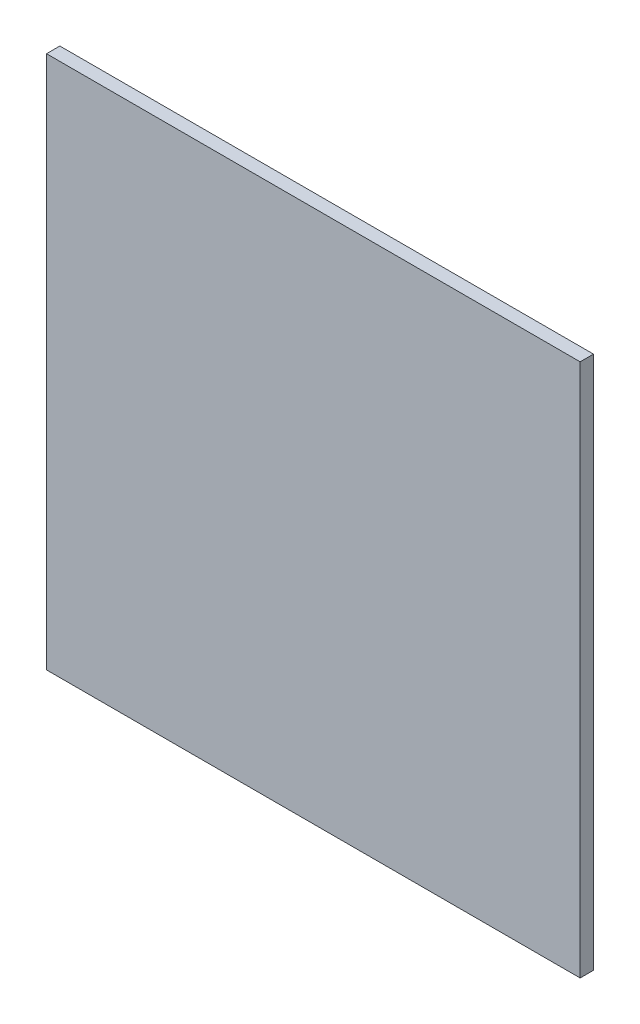
ISO-10303-21;
HEADER;
FILE_DESCRIPTION(('STEP AP214'),'2;1');
FILE_NAME('part.step','',(''),(''),'','','');
FILE_SCHEMA(('AUTOMOTIVE_DESIGN { 1 0 10303 214 1 1 1 1 }'));
ENDSEC;
DATA;
#1=APPLICATION_CONTEXT('core data for automotive mechanical design processes');
#2=APPLICATION_PROTOCOL_DEFINITION('international standard','automotive_design',2000,#1);
#3=PRODUCT_CONTEXT('',#1,'mechanical');
#4=PRODUCT('Part','Part','',(#3));
#5=PRODUCT_RELATED_PRODUCT_CATEGORY('part','',(#4));
#6=PRODUCT_DEFINITION_FORMATION('','',#4);
#7=PRODUCT_DEFINITION_CONTEXT('part definition',#1,'design');
#8=PRODUCT_DEFINITION('design','',#6,#7);
#9=PRODUCT_DEFINITION_SHAPE('','',#8);
#10=(LENGTH_UNIT() NAMED_UNIT(*) SI_UNIT(.MILLI.,.METRE.));
#11=(NAMED_UNIT(*) PLANE_ANGLE_UNIT() SI_UNIT($,.RADIAN.));
#12=(NAMED_UNIT(*) SI_UNIT($,.STERADIAN.) SOLID_ANGLE_UNIT());
#13=UNCERTAINTY_MEASURE_WITH_UNIT(LENGTH_MEASURE(1.E-05),#10,'distance_accuracy_value','');
#14=(GEOMETRIC_REPRESENTATION_CONTEXT(3) GLOBAL_UNCERTAINTY_ASSIGNED_CONTEXT((#13)) GLOBAL_UNIT_ASSIGNED_CONTEXT((#10,
#11,#12)) REPRESENTATION_CONTEXT('',''));
#15=CARTESIAN_POINT('',(0.,0.,0.));
#16=DIRECTION('',(0.,0.,1.));
#17=DIRECTION('',(1.,0.,0.));
#18=AXIS2_PLACEMENT_3D('',#15,#16,#17);
#19=CARTESIAN_POINT('',(200.,-200.,10.));
#20=DIRECTION('',(-1.,0.,0.));
#21=DIRECTION('',(0.,0.,1.));
#22=AXIS2_PLACEMENT_3D('',#19,#20,#21);
#23=PLANE('',#22);
#24=DIRECTION('',(0.,1.,0.));
#25=VECTOR('',#24,1.);
#26=CARTESIAN_POINT('',(200.,-200.,0.));
#27=LINE('',#26,#25);
#28=CARTESIAN_POINT('',(200.,-200.,0.));
#29=VERTEX_POINT('',#28);
#30=CARTESIAN_POINT('',(200.,200.,0.));
#31=VERTEX_POINT('',#30);
#32=EDGE_CURVE('E102',#29,#31,#27,.T.);
#33=ORIENTED_EDGE('',*,*,#32,.T.);
#34=DIRECTION('',(0.,0.,-1.));
#35=VECTOR('',#34,1.);
#36=CARTESIAN_POINT('',(200.,200.,10.));
#37=LINE('',#36,#35);
#38=CARTESIAN_POINT('',(200.,200.,10.));
#39=VERTEX_POINT('',#38);
#40=EDGE_CURVE('E11',#39,#31,#37,.T.);
#41=ORIENTED_EDGE('',*,*,#40,.F.);
#42=DIRECTION('',(0.,1.,0.));
#43=VECTOR('',#42,1.);
#44=CARTESIAN_POINT('',(200.,-200.,10.));
#45=LINE('',#44,#43);
#46=CARTESIAN_POINT('',(200.,-200.,10.));
#47=VERTEX_POINT('',#46);
#48=EDGE_CURVE('E90',#47,#39,#45,.T.);
#49=ORIENTED_EDGE('',*,*,#48,.F.);
#50=DIRECTION('',(0.,0.,-1.));
#51=VECTOR('',#50,1.);
#52=CARTESIAN_POINT('',(200.,-200.,10.));
#53=LINE('',#52,#51);
#54=EDGE_CURVE('E98',#47,#29,#53,.T.);
#55=ORIENTED_EDGE('',*,*,#54,.T.);
#56=EDGE_LOOP('',(#33,#41,#49,#55));
#57=FACE_BOUND('',#56,.T.);
#58=ADVANCED_FACE('F39',(#57),#23,.F.);
#59=CARTESIAN_POINT('',(-200.,200.,10.));
#60=DIRECTION('',(0.,-1.,0.));
#61=DIRECTION('',(0.,0.,-1.));
#62=AXIS2_PLACEMENT_3D('',#59,#60,#61);
#63=PLANE('',#62);
#64=DIRECTION('',(-1.,0.,0.));
#65=VECTOR('',#64,1.);
#66=CARTESIAN_POINT('',(-200.,200.,0.));
#67=LINE('',#66,#65);
#68=CARTESIAN_POINT('',(-200.,200.,0.));
#69=VERTEX_POINT('',#68);
#70=EDGE_CURVE('E94',#31,#69,#67,.T.);
#71=ORIENTED_EDGE('',*,*,#70,.T.);
#72=DIRECTION('',(0.,0.,-1.));
#73=VECTOR('',#72,1.);
#74=CARTESIAN_POINT('',(-200.,200.,10.));
#75=LINE('',#74,#73);
#76=CARTESIAN_POINT('',(-200.,200.,10.));
#77=VERTEX_POINT('',#76);
#78=EDGE_CURVE('E47',#77,#69,#75,.T.);
#79=ORIENTED_EDGE('',*,*,#78,.F.);
#80=DIRECTION('',(-1.,0.,0.));
#81=VECTOR('',#80,1.);
#82=CARTESIAN_POINT('',(-200.,200.,10.));
#83=LINE('',#82,#81);
#84=EDGE_CURVE('E85',#39,#77,#83,.T.);
#85=ORIENTED_EDGE('',*,*,#84,.F.);
#86=ORIENTED_EDGE('',*,*,#40,.T.);
#87=EDGE_LOOP('',(#71,#79,#85,#86));
#88=FACE_BOUND('',#87,.T.);
#89=ADVANCED_FACE('F93',(#88),#63,.F.);
#90=CARTESIAN_POINT('',(-200.,-200.,10.));
#91=DIRECTION('',(1.,0.,0.));
#92=DIRECTION('',(0.,0.,-1.));
#93=AXIS2_PLACEMENT_3D('',#90,#91,#92);
#94=PLANE('',#93);
#95=DIRECTION('',(0.,-1.,0.));
#96=VECTOR('',#95,1.);
#97=CARTESIAN_POINT('',(-200.,-200.,0.));
#98=LINE('',#97,#96);
#99=CARTESIAN_POINT('',(-200.,-200.,0.));
#100=VERTEX_POINT('',#99);
#101=EDGE_CURVE('E72',#69,#100,#98,.T.);
#102=ORIENTED_EDGE('',*,*,#101,.T.);
#103=DIRECTION('',(0.,0.,-1.));
#104=VECTOR('',#103,1.);
#105=CARTESIAN_POINT('',(-200.,-200.,10.));
#106=LINE('',#105,#104);
#107=CARTESIAN_POINT('',(-200.,-200.,10.));
#108=VERTEX_POINT('',#107);
#109=EDGE_CURVE('E95',#108,#100,#106,.T.);
#110=ORIENTED_EDGE('',*,*,#109,.F.);
#111=DIRECTION('',(0.,-1.,0.));
#112=VECTOR('',#111,1.);
#113=CARTESIAN_POINT('',(-200.,-200.,10.));
#114=LINE('',#113,#112);
#115=EDGE_CURVE('E88',#77,#108,#114,.T.);
#116=ORIENTED_EDGE('',*,*,#115,.F.);
#117=ORIENTED_EDGE('',*,*,#78,.T.);
#118=EDGE_LOOP('',(#102,#110,#116,#117));
#119=FACE_BOUND('',#118,.T.);
#120=ADVANCED_FACE('F96',(#119),#94,.F.);
#121=CARTESIAN_POINT('',(-200.,-200.,10.));
#122=DIRECTION('',(0.,1.,0.));
#123=DIRECTION('',(0.,0.,1.));
#124=AXIS2_PLACEMENT_3D('',#121,#122,#123);
#125=PLANE('',#124);
#126=DIRECTION('',(1.,0.,0.));
#127=VECTOR('',#126,1.);
#128=CARTESIAN_POINT('',(-200.,-200.,0.));
#129=LINE('',#128,#127);
#130=EDGE_CURVE('E78',#100,#29,#129,.T.);
#131=ORIENTED_EDGE('',*,*,#130,.T.);
#132=ORIENTED_EDGE('',*,*,#54,.F.);
#133=DIRECTION('',(1.,0.,0.));
#134=VECTOR('',#133,1.);
#135=CARTESIAN_POINT('',(-200.,-200.,10.));
#136=LINE('',#135,#134);
#137=EDGE_CURVE('E55',#108,#47,#136,.T.);
#138=ORIENTED_EDGE('',*,*,#137,.F.);
#139=ORIENTED_EDGE('',*,*,#109,.T.);
#140=EDGE_LOOP('',(#131,#132,#138,#139));
#141=FACE_BOUND('',#140,.T.);
#142=ADVANCED_FACE('F109',(#141),#125,.F.);
#143=CARTESIAN_POINT('',(0.,0.,10.));
#144=DIRECTION('',(0.,0.,-1.));
#145=DIRECTION('',(-1.,0.,0.));
#146=AXIS2_PLACEMENT_3D('',#143,#144,#145);
#147=PLANE('',#146);
#148=ORIENTED_EDGE('',*,*,#48,.T.);
#149=ORIENTED_EDGE('',*,*,#84,.T.);
#150=ORIENTED_EDGE('',*,*,#115,.T.);
#151=ORIENTED_EDGE('',*,*,#137,.T.);
#152=EDGE_LOOP('',(#148,#149,#150,#151));
#153=FACE_BOUND('',#152,.T.);
#154=ADVANCED_FACE('F86',(#153),#147,.F.);
#155=CARTESIAN_POINT('',(0.,0.,0.));
#156=DIRECTION('',(0.,0.,-1.));
#157=DIRECTION('',(-1.,0.,0.));
#158=AXIS2_PLACEMENT_3D('',#155,#156,#157);
#159=PLANE('',#158);
#160=ORIENTED_EDGE('',*,*,#32,.F.);
#161=ORIENTED_EDGE('',*,*,#130,.F.);
#162=ORIENTED_EDGE('',*,*,#101,.F.);
#163=ORIENTED_EDGE('',*,*,#70,.F.);
#164=EDGE_LOOP('',(#160,#161,#162,#163));
#165=FACE_BOUND('',#164,.T.);
#166=ADVANCED_FACE('F112',(#165),#159,.T.);
#167=CLOSED_SHELL('',(#58,#89,#120,#142,#154,#166));
#168=MANIFOLD_SOLID_BREP('B2',#167);
#169=ADVANCED_BREP_SHAPE_REPRESENTATION('',(#18,#168),#14);
#170=SHAPE_DEFINITION_REPRESENTATION(#9,#169);
ENDSEC;
END-ISO-10303-21;
